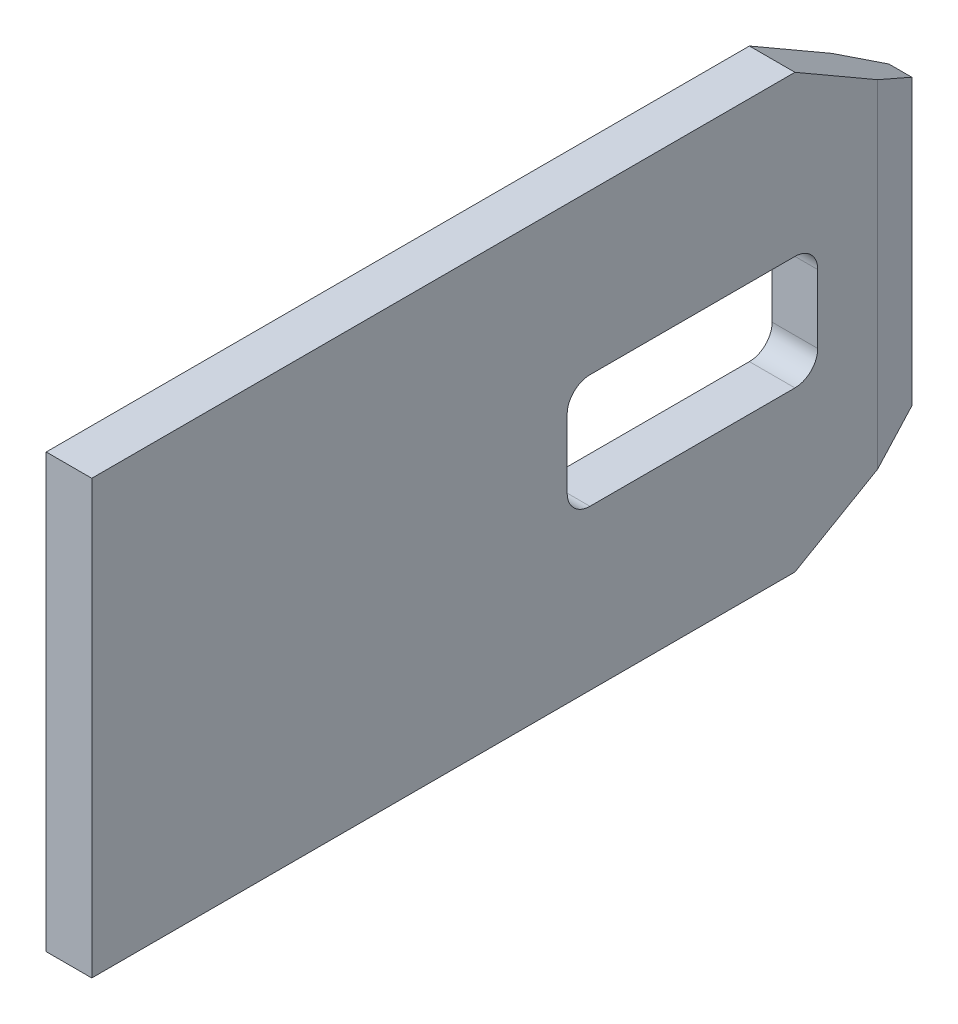
ISO-10303-21;
HEADER;
FILE_DESCRIPTION(('STEP AP214'),'2;1');
FILE_NAME('part.step','',(''),(''),'','','');
FILE_SCHEMA(('AUTOMOTIVE_DESIGN { 1 0 10303 214 1 1 1 1 }'));
ENDSEC;
DATA;
#1=APPLICATION_CONTEXT('core data for automotive mechanical design processes');
#2=APPLICATION_PROTOCOL_DEFINITION('international standard','automotive_design',2000,#1);
#3=PRODUCT_CONTEXT('',#1,'mechanical');
#4=PRODUCT('Part','Part','',(#3));
#5=PRODUCT_RELATED_PRODUCT_CATEGORY('part','',(#4));
#6=PRODUCT_DEFINITION_FORMATION('','',#4);
#7=PRODUCT_DEFINITION_CONTEXT('part definition',#1,'design');
#8=PRODUCT_DEFINITION('design','',#6,#7);
#9=PRODUCT_DEFINITION_SHAPE('','',#8);
#10=(LENGTH_UNIT() NAMED_UNIT(*) SI_UNIT(.MILLI.,.METRE.));
#11=(NAMED_UNIT(*) PLANE_ANGLE_UNIT() SI_UNIT($,.RADIAN.));
#12=(NAMED_UNIT(*) SI_UNIT($,.STERADIAN.) SOLID_ANGLE_UNIT());
#13=UNCERTAINTY_MEASURE_WITH_UNIT(LENGTH_MEASURE(1.E-05),#10,'distance_accuracy_value','');
#14=(GEOMETRIC_REPRESENTATION_CONTEXT(3) GLOBAL_UNCERTAINTY_ASSIGNED_CONTEXT((#13)) GLOBAL_UNIT_ASSIGNED_CONTEXT((#10,
#11,#12)) REPRESENTATION_CONTEXT('',''));
#15=CARTESIAN_POINT('',(0.,0.,0.));
#16=DIRECTION('',(0.,0.,1.));
#17=DIRECTION('',(1.,0.,0.));
#18=AXIS2_PLACEMENT_3D('',#15,#16,#17);
#19=CARTESIAN_POINT('',(-0.2,1.25,-7.3));
#20=DIRECTION('',(0.,0.,-1.));
#21=DIRECTION('',(0.,-1.,0.));
#22=AXIS2_PLACEMENT_3D('',#19,#20,#21);
#23=PLANE('',#22);
#24=DIRECTION('',(0.,1.,0.));
#25=VECTOR('',#24,1.);
#26=CARTESIAN_POINT('',(-0.1,-5.,-7.3));
#27=LINE('',#26,#25);
#28=CARTESIAN_POINT('',(-0.1,-1.25,-7.3));
#29=VERTEX_POINT('',#28);
#30=CARTESIAN_POINT('',(-0.1,1.25,-7.3));
#31=VERTEX_POINT('',#30);
#32=EDGE_CURVE('E39',#29,#31,#27,.T.);
#33=ORIENTED_EDGE('',*,*,#32,.T.);
#34=DIRECTION('',(1.,0.,0.));
#35=VECTOR('',#34,1.);
#36=CARTESIAN_POINT('',(-0.2,1.25,-7.3));
#37=LINE('',#36,#35);
#38=CARTESIAN_POINT('',(0.1,1.25,-7.3));
#39=VERTEX_POINT('',#38);
#40=EDGE_CURVE('E206',#31,#39,#37,.T.);
#41=ORIENTED_EDGE('',*,*,#40,.T.);
#42=DIRECTION('',(0.,1.,0.));
#43=VECTOR('',#42,1.);
#44=CARTESIAN_POINT('',(0.1,-5.,-7.3));
#45=LINE('',#44,#43);
#46=CARTESIAN_POINT('',(0.1,-1.25,-7.3));
#47=VERTEX_POINT('',#46);
#48=EDGE_CURVE('E9',#47,#39,#45,.T.);
#49=ORIENTED_EDGE('',*,*,#48,.F.);
#50=DIRECTION('',(1.,0.,0.));
#51=VECTOR('',#50,1.);
#52=CARTESIAN_POINT('',(-0.2,-1.25,-7.3));
#53=LINE('',#52,#51);
#54=EDGE_CURVE('E247',#29,#47,#53,.T.);
#55=ORIENTED_EDGE('',*,*,#54,.F.);
#56=EDGE_LOOP('',(#33,#41,#49,#55));
#57=FACE_BOUND('',#56,.T.);
#58=ADVANCED_FACE('F14',(#57),#23,.T.);
#59=CARTESIAN_POINT('',(0.1,-5.,-7.3));
#60=DIRECTION('',(0.970142500145391,0.,-0.242535625036098));
#61=DIRECTION('',(0.,-1.,0.));
#62=AXIS2_PLACEMENT_3D('',#59,#60,#61);
#63=PLANE('',#62);
#64=DIRECTION('',(0.211603684758061,-0.488677777425141,0.846414739030244));
#65=VECTOR('',#64,1.);
#66=CARTESIAN_POINT('',(0.287169866519,-1.682250291276,-6.551320533924));
#67=LINE('',#66,#65);
#68=CARTESIAN_POINT('',(0.2,-1.480940107676,-6.9));
#69=VERTEX_POINT('',#68);
#70=EDGE_CURVE('E242',#47,#69,#67,.T.);
#71=ORIENTED_EDGE('',*,*,#70,.F.);
#72=ORIENTED_EDGE('',*,*,#48,.T.);
#73=DIRECTION('',(-0.211603684758061,-0.488677777425141,-0.846414739030244));
#74=VECTOR('',#73,1.);
#75=CARTESIAN_POINT('',(-0.09543240142169,0.798668201723,-8.081729605687));
#76=LINE('',#75,#74);
#77=CARTESIAN_POINT('',(0.2,1.480940107676,-6.9));
#78=VERTEX_POINT('',#77);
#79=EDGE_CURVE('E246',#78,#39,#76,.T.);
#80=ORIENTED_EDGE('',*,*,#79,.F.);
#81=DIRECTION('',(0.,1.,0.));
#82=VECTOR('',#81,1.);
#83=CARTESIAN_POINT('',(0.2,-5.,-6.9));
#84=LINE('',#83,#82);
#85=EDGE_CURVE('E259',#69,#78,#84,.T.);
#86=ORIENTED_EDGE('',*,*,#85,.F.);
#87=EDGE_LOOP('',(#71,#72,#80,#86));
#88=FACE_BOUND('',#87,.T.);
#89=ADVANCED_FACE('F476',(#88),#63,.T.);
#90=CARTESIAN_POINT('',(-0.2,0.3,-6.17416697508));
#91=DIRECTION('',(-1.,0.,0.));
#92=DIRECTION('',(0.,1.,0.));
#93=AXIS2_PLACEMENT_3D('',#90,#91,#92);
#94=CYLINDRICAL_SURFACE('',#93,0.2);
#95=DIRECTION('',(1.,0.,0.));
#96=VECTOR('',#95,1.);
#97=CARTESIAN_POINT('',(-0.2,0.3,-6.37416697508));
#98=LINE('',#97,#96);
#99=CARTESIAN_POINT('',(-0.2,0.3,-6.37416697508));
#100=VERTEX_POINT('',#99);
#101=CARTESIAN_POINT('',(0.2,0.3,-6.37416697508));
#102=VERTEX_POINT('',#101);
#103=EDGE_CURVE('E25',#100,#102,#98,.T.);
#104=ORIENTED_EDGE('',*,*,#103,.T.);
#105=CARTESIAN_POINT('',(0.2,0.3,-6.17416697508));
#106=DIRECTION('',(1.,0.,0.));
#107=DIRECTION('',(0.,1.,0.));
#108=AXIS2_PLACEMENT_3D('',#105,#106,#107);
#109=CIRCLE('',#108,0.2);
#110=CARTESIAN_POINT('',(0.2,0.5,-6.17416697508));
#111=VERTEX_POINT('',#110);
#112=EDGE_CURVE('E263',#102,#111,#109,.T.);
#113=ORIENTED_EDGE('',*,*,#112,.T.);
#114=DIRECTION('',(1.,0.,0.));
#115=VECTOR('',#114,1.);
#116=CARTESIAN_POINT('',(-0.2,0.5,-6.17416697508));
#117=LINE('',#116,#115);
#118=CARTESIAN_POINT('',(-0.2,0.5,-6.17416697508));
#119=VERTEX_POINT('',#118);
#120=EDGE_CURVE('E142',#119,#111,#117,.T.);
#121=ORIENTED_EDGE('',*,*,#120,.F.);
#122=CARTESIAN_POINT('',(-0.2,0.3,-6.17416697508));
#123=DIRECTION('',(1.,0.,0.));
#124=DIRECTION('',(0.,1.,0.));
#125=AXIS2_PLACEMENT_3D('',#122,#123,#124);
#126=CIRCLE('',#125,0.2);
#127=EDGE_CURVE('E153',#100,#119,#126,.T.);
#128=ORIENTED_EDGE('',*,*,#127,.F.);
#129=EDGE_LOOP('',(#104,#113,#121,#128));
#130=FACE_BOUND('',#129,.T.);
#131=ADVANCED_FACE('F379',(#130),#94,.F.);
#132=CARTESIAN_POINT('',(-0.2,0.3,-6.37416697508));
#133=DIRECTION('',(0.,0.,-1.));
#134=DIRECTION('',(0.,-1.,0.));
#135=AXIS2_PLACEMENT_3D('',#132,#133,#134);
#136=PLANE('',#135);
#137=DIRECTION('',(0.,-1.,0.));
#138=VECTOR('',#137,1.);
#139=CARTESIAN_POINT('',(-0.2,0.3,-6.37416697508));
#140=LINE('',#139,#138);
#141=CARTESIAN_POINT('',(-0.2,-0.3,-6.37416697508));
#142=VERTEX_POINT('',#141);
#143=EDGE_CURVE('E146',#100,#142,#140,.T.);
#144=ORIENTED_EDGE('',*,*,#143,.T.);
#145=DIRECTION('',(1.,0.,0.));
#146=VECTOR('',#145,1.);
#147=CARTESIAN_POINT('',(-0.2,-0.3,-6.37416697508));
#148=LINE('',#147,#146);
#149=CARTESIAN_POINT('',(0.2,-0.3,-6.37416697508));
#150=VERTEX_POINT('',#149);
#151=EDGE_CURVE('E129',#142,#150,#148,.T.);
#152=ORIENTED_EDGE('',*,*,#151,.T.);
#153=DIRECTION('',(0.,-1.,0.));
#154=VECTOR('',#153,1.);
#155=CARTESIAN_POINT('',(0.2,0.3,-6.37416697508));
#156=LINE('',#155,#154);
#157=EDGE_CURVE('E267',#102,#150,#156,.T.);
#158=ORIENTED_EDGE('',*,*,#157,.F.);
#159=ORIENTED_EDGE('',*,*,#103,.F.);
#160=EDGE_LOOP('',(#144,#152,#158,#159));
#161=FACE_BOUND('',#160,.T.);
#162=ADVANCED_FACE('F147',(#161),#136,.F.);
#163=CARTESIAN_POINT('',(-0.2,0.5,-4.37416697508));
#164=DIRECTION('',(0.,1.,0.));
#165=DIRECTION('',(0.,0.,-1.));
#166=AXIS2_PLACEMENT_3D('',#163,#164,#165);
#167=PLANE('',#166);
#168=DIRECTION('',(0.,0.,-1.));
#169=VECTOR('',#168,1.);
#170=CARTESIAN_POINT('',(-0.2,0.5,-4.37416697508));
#171=LINE('',#170,#169);
#172=CARTESIAN_POINT('',(-0.2,0.5,-4.37416697508));
#173=VERTEX_POINT('',#172);
#174=EDGE_CURVE('E276',#173,#119,#171,.T.);
#175=ORIENTED_EDGE('',*,*,#174,.T.);
#176=ORIENTED_EDGE('',*,*,#120,.T.);
#177=DIRECTION('',(0.,0.,-1.));
#178=VECTOR('',#177,1.);
#179=CARTESIAN_POINT('',(0.2,0.5,-4.37416697508));
#180=LINE('',#179,#178);
#181=CARTESIAN_POINT('',(0.2,0.5,-4.37416697508));
#182=VERTEX_POINT('',#181);
#183=EDGE_CURVE('E268',#182,#111,#180,.T.);
#184=ORIENTED_EDGE('',*,*,#183,.F.);
#185=DIRECTION('',(1.,0.,0.));
#186=VECTOR('',#185,1.);
#187=CARTESIAN_POINT('',(-0.2,0.5,-4.37416697508));
#188=LINE('',#187,#186);
#189=EDGE_CURVE('E143',#173,#182,#188,.T.);
#190=ORIENTED_EDGE('',*,*,#189,.F.);
#191=EDGE_LOOP('',(#175,#176,#184,#190));
#192=FACE_BOUND('',#191,.T.);
#193=ADVANCED_FACE('F383',(#192),#167,.F.);
#194=CARTESIAN_POINT('',(-0.2,-0.3,-6.17416697508));
#195=DIRECTION('',(-1.,0.,0.));
#196=DIRECTION('',(0.,1.,0.));
#197=AXIS2_PLACEMENT_3D('',#194,#195,#196);
#198=CYLINDRICAL_SURFACE('',#197,0.2);
#199=DIRECTION('',(1.,0.,0.));
#200=VECTOR('',#199,1.);
#201=CARTESIAN_POINT('',(-0.2,-0.5,-6.17416697508));
#202=LINE('',#201,#200);
#203=CARTESIAN_POINT('',(-0.2,-0.5,-6.17416697508));
#204=VERTEX_POINT('',#203);
#205=CARTESIAN_POINT('',(0.2,-0.5,-6.17416697508));
#206=VERTEX_POINT('',#205);
#207=EDGE_CURVE('E180',#204,#206,#202,.T.);
#208=ORIENTED_EDGE('',*,*,#207,.T.);
#209=CARTESIAN_POINT('',(0.2,-0.3,-6.17416697508));
#210=DIRECTION('',(1.,0.,0.));
#211=DIRECTION('',(0.,1.,0.));
#212=AXIS2_PLACEMENT_3D('',#209,#210,#211);
#213=CIRCLE('',#212,0.2);
#214=EDGE_CURVE('E137',#206,#150,#213,.T.);
#215=ORIENTED_EDGE('',*,*,#214,.T.);
#216=ORIENTED_EDGE('',*,*,#151,.F.);
#217=CARTESIAN_POINT('',(-0.2,-0.3,-6.17416697508));
#218=DIRECTION('',(1.,0.,0.));
#219=DIRECTION('',(0.,1.,0.));
#220=AXIS2_PLACEMENT_3D('',#217,#218,#219);
#221=CIRCLE('',#220,0.2);
#222=EDGE_CURVE('E134',#204,#142,#221,.T.);
#223=ORIENTED_EDGE('',*,*,#222,.F.);
#224=EDGE_LOOP('',(#208,#215,#216,#223));
#225=FACE_BOUND('',#224,.T.);
#226=ADVANCED_FACE('F132',(#225),#198,.F.);
#227=CARTESIAN_POINT('',(-0.2,0.3,-4.37416697508));
#228=DIRECTION('',(-1.,0.,0.));
#229=DIRECTION('',(0.,1.,0.));
#230=AXIS2_PLACEMENT_3D('',#227,#228,#229);
#231=CYLINDRICAL_SURFACE('',#230,0.2);
#232=ORIENTED_EDGE('',*,*,#189,.T.);
#233=CARTESIAN_POINT('',(0.2,0.3,-4.37416697508));
#234=DIRECTION('',(1.,0.,0.));
#235=DIRECTION('',(0.,1.,0.));
#236=AXIS2_PLACEMENT_3D('',#233,#234,#235);
#237=CIRCLE('',#236,0.2);
#238=CARTESIAN_POINT('',(0.2,0.3,-4.17416697508));
#239=VERTEX_POINT('',#238);
#240=EDGE_CURVE('E191',#182,#239,#237,.T.);
#241=ORIENTED_EDGE('',*,*,#240,.T.);
#242=DIRECTION('',(1.,0.,0.));
#243=VECTOR('',#242,1.);
#244=CARTESIAN_POINT('',(-0.2,0.3,-4.17416697508));
#245=LINE('',#244,#243);
#246=CARTESIAN_POINT('',(-0.2,0.3,-4.17416697508));
#247=VERTEX_POINT('',#246);
#248=EDGE_CURVE('E176',#247,#239,#245,.T.);
#249=ORIENTED_EDGE('',*,*,#248,.F.);
#250=CARTESIAN_POINT('',(-0.2,0.3,-4.37416697508));
#251=DIRECTION('',(1.,0.,0.));
#252=DIRECTION('',(0.,1.,0.));
#253=AXIS2_PLACEMENT_3D('',#250,#251,#252);
#254=CIRCLE('',#253,0.2);
#255=EDGE_CURVE('E18',#173,#247,#254,.T.);
#256=ORIENTED_EDGE('',*,*,#255,.F.);
#257=EDGE_LOOP('',(#232,#241,#249,#256));
#258=FACE_BOUND('',#257,.T.);
#259=ADVANCED_FACE('F384',(#258),#231,.F.);
#260=CARTESIAN_POINT('',(-0.2,-0.5,-6.17416697508));
#261=DIRECTION('',(0.,-1.,0.));
#262=DIRECTION('',(-1.,0.,0.));
#263=AXIS2_PLACEMENT_3D('',#260,#261,#262);
#264=PLANE('',#263);
#265=DIRECTION('',(0.,0.,1.));
#266=VECTOR('',#265,1.);
#267=CARTESIAN_POINT('',(-0.2,-0.5,-6.17416697508));
#268=LINE('',#267,#266);
#269=CARTESIAN_POINT('',(-0.2,-0.5,-4.37416697508));
#270=VERTEX_POINT('',#269);
#271=EDGE_CURVE('E159',#204,#270,#268,.T.);
#272=ORIENTED_EDGE('',*,*,#271,.T.);
#273=DIRECTION('',(1.,0.,0.));
#274=VECTOR('',#273,1.);
#275=CARTESIAN_POINT('',(-0.2,-0.5,-4.37416697508));
#276=LINE('',#275,#274);
#277=CARTESIAN_POINT('',(0.2,-0.5,-4.37416697508));
#278=VERTEX_POINT('',#277);
#279=EDGE_CURVE('E181',#270,#278,#276,.T.);
#280=ORIENTED_EDGE('',*,*,#279,.T.);
#281=DIRECTION('',(0.,0.,1.));
#282=VECTOR('',#281,1.);
#283=CARTESIAN_POINT('',(0.2,-0.5,-6.17416697508));
#284=LINE('',#283,#282);
#285=EDGE_CURVE('E255',#206,#278,#284,.T.);
#286=ORIENTED_EDGE('',*,*,#285,.F.);
#287=ORIENTED_EDGE('',*,*,#207,.F.);
#288=EDGE_LOOP('',(#272,#280,#286,#287));
#289=FACE_BOUND('',#288,.T.);
#290=ADVANCED_FACE('F375',(#289),#264,.F.);
#291=CARTESIAN_POINT('',(-0.2,-0.3,-4.17416697508));
#292=DIRECTION('',(0.,0.,1.));
#293=DIRECTION('',(1.,0.,0.));
#294=AXIS2_PLACEMENT_3D('',#291,#292,#293);
#295=PLANE('',#294);
#296=DIRECTION('',(0.,1.,0.));
#297=VECTOR('',#296,1.);
#298=CARTESIAN_POINT('',(-0.2,-0.3,-4.17416697508));
#299=LINE('',#298,#297);
#300=CARTESIAN_POINT('',(-0.2,-0.3,-4.17416697508));
#301=VERTEX_POINT('',#300);
#302=EDGE_CURVE('E171',#301,#247,#299,.T.);
#303=ORIENTED_EDGE('',*,*,#302,.T.);
#304=ORIENTED_EDGE('',*,*,#248,.T.);
#305=DIRECTION('',(0.,1.,0.));
#306=VECTOR('',#305,1.);
#307=CARTESIAN_POINT('',(0.2,-0.3,-4.17416697508));
#308=LINE('',#307,#306);
#309=CARTESIAN_POINT('',(0.2,-0.3,-4.17416697508));
#310=VERTEX_POINT('',#309);
#311=EDGE_CURVE('E187',#310,#239,#308,.T.);
#312=ORIENTED_EDGE('',*,*,#311,.F.);
#313=DIRECTION('',(1.,0.,0.));
#314=VECTOR('',#313,1.);
#315=CARTESIAN_POINT('',(-0.2,-0.3,-4.17416697508));
#316=LINE('',#315,#314);
#317=EDGE_CURVE('E184',#301,#310,#316,.T.);
#318=ORIENTED_EDGE('',*,*,#317,.F.);
#319=EDGE_LOOP('',(#303,#304,#312,#318));
#320=FACE_BOUND('',#319,.T.);
#321=ADVANCED_FACE('F492',(#320),#295,.F.);
#322=CARTESIAN_POINT('',(-0.2,-0.3,-4.37416697508));
#323=DIRECTION('',(-1.,0.,0.));
#324=DIRECTION('',(0.,1.,0.));
#325=AXIS2_PLACEMENT_3D('',#322,#323,#324);
#326=CYLINDRICAL_SURFACE('',#325,0.2);
#327=ORIENTED_EDGE('',*,*,#317,.T.);
#328=CARTESIAN_POINT('',(0.2,-0.3,-4.37416697508));
#329=DIRECTION('',(1.,0.,0.));
#330=DIRECTION('',(0.,1.,0.));
#331=AXIS2_PLACEMENT_3D('',#328,#329,#330);
#332=CIRCLE('',#331,0.2);
#333=EDGE_CURVE('E192',#310,#278,#332,.T.);
#334=ORIENTED_EDGE('',*,*,#333,.T.);
#335=ORIENTED_EDGE('',*,*,#279,.F.);
#336=CARTESIAN_POINT('',(-0.2,-0.3,-4.37416697508));
#337=DIRECTION('',(1.,0.,0.));
#338=DIRECTION('',(0.,1.,0.));
#339=AXIS2_PLACEMENT_3D('',#336,#337,#338);
#340=CIRCLE('',#339,0.2);
#341=EDGE_CURVE('E175',#301,#270,#340,.T.);
#342=ORIENTED_EDGE('',*,*,#341,.F.);
#343=EDGE_LOOP('',(#327,#334,#335,#342));
#344=FACE_BOUND('',#343,.T.);
#345=ADVANCED_FACE('F489',(#344),#326,.F.);
#346=CARTESIAN_POINT('',(-0.2,-5.,-6.9));
#347=DIRECTION('',(-0.970142500145391,0.,-0.242535625036098));
#348=DIRECTION('',(-0.242535625036098,0.,0.970142500145391));
#349=AXIS2_PLACEMENT_3D('',#346,#347,#348);
#350=PLANE('',#349);
#351=DIRECTION('',(0.211603684758061,0.488677777425141,-0.846414739030244));
#352=VECTOR('',#351,1.);
#353=CARTESIAN_POINT('',(-0.334184791892,-1.790826610556,-6.363260832432));
#354=LINE('',#353,#352);
#355=CARTESIAN_POINT('',(-0.2,-1.480940107676,-6.9));
#356=VERTEX_POINT('',#355);
#357=EDGE_CURVE('E251',#356,#29,#354,.T.);
#358=ORIENTED_EDGE('',*,*,#357,.F.);
#359=DIRECTION('',(0.,1.,0.));
#360=VECTOR('',#359,1.);
#361=CARTESIAN_POINT('',(-0.2,-5.,-6.9));
#362=LINE('',#361,#360);
#363=CARTESIAN_POINT('',(-0.2,1.480940107676,-6.9));
#364=VERTEX_POINT('',#363);
#365=EDGE_CURVE('E169',#356,#364,#362,.T.);
#366=ORIENTED_EDGE('',*,*,#365,.T.);
#367=DIRECTION('',(-0.211603684758061,0.488677777425141,0.846414739030244));
#368=VECTOR('',#367,1.);
#369=CARTESIAN_POINT('',(0.04841747604856,0.907244521004,-7.893669904194));
#370=LINE('',#369,#368);
#371=EDGE_CURVE('E195',#31,#364,#370,.T.);
#372=ORIENTED_EDGE('',*,*,#371,.F.);
#373=ORIENTED_EDGE('',*,*,#32,.F.);
#374=EDGE_LOOP('',(#358,#366,#372,#373));
#375=FACE_BOUND('',#374,.T.);
#376=ADVANCED_FACE('F471',(#375),#350,.T.);
#377=CARTESIAN_POINT('',(-0.2,1.9,-6.17416697508));
#378=DIRECTION('',(0.,0.866025403784329,-0.50000000000019));
#379=DIRECTION('',(-1.,0.,0.));
#380=AXIS2_PLACEMENT_3D('',#377,#378,#379);
#381=PLANE('',#380);
#382=DIRECTION('',(0.,-0.50000000000019,-0.866025403784329));
#383=VECTOR('',#382,1.);
#384=CARTESIAN_POINT('',(-0.2,1.9,-6.17416697508));
#385=LINE('',#384,#383);
#386=CARTESIAN_POINT('',(-0.2,1.9,-6.17416697508));
#387=VERTEX_POINT('',#386);
#388=EDGE_CURVE('E233',#387,#364,#385,.T.);
#389=ORIENTED_EDGE('',*,*,#388,.F.);
#390=DIRECTION('',(1.,0.,0.));
#391=VECTOR('',#390,1.);
#392=CARTESIAN_POINT('',(-0.2,1.9,-6.17416697508));
#393=LINE('',#392,#391);
#394=CARTESIAN_POINT('',(0.2,1.9,-6.17416697508));
#395=VERTEX_POINT('',#394);
#396=EDGE_CURVE('E238',#387,#395,#393,.T.);
#397=ORIENTED_EDGE('',*,*,#396,.T.);
#398=DIRECTION('',(0.,-0.50000000000019,-0.866025403784329));
#399=VECTOR('',#398,1.);
#400=CARTESIAN_POINT('',(0.2,1.9,-6.17416697508));
#401=LINE('',#400,#399);
#402=EDGE_CURVE('E280',#395,#78,#401,.T.);
#403=ORIENTED_EDGE('',*,*,#402,.T.);
#404=ORIENTED_EDGE('',*,*,#79,.T.);
#405=ORIENTED_EDGE('',*,*,#40,.F.);
#406=ORIENTED_EDGE('',*,*,#371,.T.);
#407=EDGE_LOOP('',(#389,#397,#403,#404,#405,#406));
#408=FACE_BOUND('',#407,.T.);
#409=ADVANCED_FACE('F329',(#408),#381,.T.);
#410=CARTESIAN_POINT('',(-0.2,-1.25,-7.3));
#411=DIRECTION('',(0.,-0.866025403784329,-0.50000000000019));
#412=DIRECTION('',(0.,0.50000000000019,-0.866025403784329));
#413=AXIS2_PLACEMENT_3D('',#410,#411,#412);
#414=PLANE('',#413);
#415=ORIENTED_EDGE('',*,*,#357,.T.);
#416=ORIENTED_EDGE('',*,*,#54,.T.);
#417=ORIENTED_EDGE('',*,*,#70,.T.);
#418=DIRECTION('',(0.,-0.50000000000019,0.866025403784329));
#419=VECTOR('',#418,1.);
#420=CARTESIAN_POINT('',(0.2,-1.25,-7.3));
#421=LINE('',#420,#419);
#422=CARTESIAN_POINT('',(0.2,-1.9,-6.17416697508));
#423=VERTEX_POINT('',#422);
#424=EDGE_CURVE('E227',#69,#423,#421,.T.);
#425=ORIENTED_EDGE('',*,*,#424,.T.);
#426=DIRECTION('',(1.,0.,0.));
#427=VECTOR('',#426,1.);
#428=CARTESIAN_POINT('',(-0.2,-1.9,-6.17416697508));
#429=LINE('',#428,#427);
#430=CARTESIAN_POINT('',(-0.2,-1.9,-6.17416697508));
#431=VERTEX_POINT('',#430);
#432=EDGE_CURVE('E216',#431,#423,#429,.T.);
#433=ORIENTED_EDGE('',*,*,#432,.F.);
#434=DIRECTION('',(0.,-0.50000000000019,0.866025403784329));
#435=VECTOR('',#434,1.);
#436=CARTESIAN_POINT('',(-0.2,-1.25,-7.3));
#437=LINE('',#436,#435);
#438=EDGE_CURVE('E165',#356,#431,#437,.T.);
#439=ORIENTED_EDGE('',*,*,#438,.F.);
#440=EDGE_LOOP('',(#415,#416,#417,#425,#433,#439));
#441=FACE_BOUND('',#440,.T.);
#442=ADVANCED_FACE('F473',(#441),#414,.T.);
#443=CARTESIAN_POINT('',(0.2,0.,-3.875135263003));
#444=DIRECTION('',(1.,0.,0.));
#445=DIRECTION('',(0.,-1.,0.));
#446=AXIS2_PLACEMENT_3D('',#443,#444,#445);
#447=PLANE('',#446);
#448=ORIENTED_EDGE('',*,*,#333,.F.);
#449=ORIENTED_EDGE('',*,*,#311,.T.);
#450=ORIENTED_EDGE('',*,*,#240,.F.);
#451=ORIENTED_EDGE('',*,*,#183,.T.);
#452=ORIENTED_EDGE('',*,*,#112,.F.);
#453=ORIENTED_EDGE('',*,*,#157,.T.);
#454=ORIENTED_EDGE('',*,*,#214,.F.);
#455=ORIENTED_EDGE('',*,*,#285,.T.);
#456=EDGE_LOOP('',(#448,#449,#450,#451,#452,#453,#454,#455));
#457=FACE_BOUND('',#456,.T.);
#458=DIRECTION('',(0.,1.,0.));
#459=VECTOR('',#458,1.);
#460=CARTESIAN_POINT('',(0.2,-1.9,0.));
#461=LINE('',#460,#459);
#462=CARTESIAN_POINT('',(0.2,-1.9,0.));
#463=VERTEX_POINT('',#462);
#464=CARTESIAN_POINT('',(0.2,1.9,0.));
#465=VERTEX_POINT('',#464);
#466=EDGE_CURVE('E221',#463,#465,#461,.T.);
#467=ORIENTED_EDGE('',*,*,#466,.F.);
#468=DIRECTION('',(0.,0.,1.));
#469=VECTOR('',#468,1.);
#470=CARTESIAN_POINT('',(0.2,-1.9,-6.17416697508));
#471=LINE('',#470,#469);
#472=EDGE_CURVE('E211',#423,#463,#471,.T.);
#473=ORIENTED_EDGE('',*,*,#472,.F.);
#474=ORIENTED_EDGE('',*,*,#424,.F.);
#475=ORIENTED_EDGE('',*,*,#85,.T.);
#476=ORIENTED_EDGE('',*,*,#402,.F.);
#477=DIRECTION('',(0.,0.,-1.));
#478=VECTOR('',#477,1.);
#479=CARTESIAN_POINT('',(0.2,1.9,0.));
#480=LINE('',#479,#478);
#481=EDGE_CURVE('E210',#465,#395,#480,.T.);
#482=ORIENTED_EDGE('',*,*,#481,.F.);
#483=EDGE_LOOP('',(#467,#473,#474,#475,#476,#482));
#484=FACE_BOUND('',#483,.T.);
#485=ADVANCED_FACE('F324',(#457,#484),#447,.T.);
#486=CARTESIAN_POINT('',(-0.2,0.,-3.875135263003));
#487=DIRECTION('',(1.,0.,0.));
#488=DIRECTION('',(0.,-1.,0.));
#489=AXIS2_PLACEMENT_3D('',#486,#487,#488);
#490=PLANE('',#489);
#491=ORIENTED_EDGE('',*,*,#271,.F.);
#492=ORIENTED_EDGE('',*,*,#222,.T.);
#493=ORIENTED_EDGE('',*,*,#143,.F.);
#494=ORIENTED_EDGE('',*,*,#127,.T.);
#495=ORIENTED_EDGE('',*,*,#174,.F.);
#496=ORIENTED_EDGE('',*,*,#255,.T.);
#497=ORIENTED_EDGE('',*,*,#302,.F.);
#498=ORIENTED_EDGE('',*,*,#341,.T.);
#499=EDGE_LOOP('',(#491,#492,#493,#494,#495,#496,#497,#498));
#500=FACE_BOUND('',#499,.T.);
#501=DIRECTION('',(0.,0.,-1.));
#502=VECTOR('',#501,1.);
#503=CARTESIAN_POINT('',(-0.2,1.9,0.));
#504=LINE('',#503,#502);
#505=CARTESIAN_POINT('',(-0.2,1.9,0.));
#506=VERTEX_POINT('',#505);
#507=EDGE_CURVE('E237',#506,#387,#504,.T.);
#508=ORIENTED_EDGE('',*,*,#507,.T.);
#509=ORIENTED_EDGE('',*,*,#388,.T.);
#510=ORIENTED_EDGE('',*,*,#365,.F.);
#511=ORIENTED_EDGE('',*,*,#438,.T.);
#512=DIRECTION('',(0.,0.,1.));
#513=VECTOR('',#512,1.);
#514=CARTESIAN_POINT('',(-0.2,-1.9,-6.17416697508));
#515=LINE('',#514,#513);
#516=CARTESIAN_POINT('',(-0.2,-1.9,0.));
#517=VERTEX_POINT('',#516);
#518=EDGE_CURVE('E207',#431,#517,#515,.T.);
#519=ORIENTED_EDGE('',*,*,#518,.T.);
#520=DIRECTION('',(0.,1.,0.));
#521=VECTOR('',#520,1.);
#522=CARTESIAN_POINT('',(-0.2,-1.9,0.));
#523=LINE('',#522,#521);
#524=EDGE_CURVE('E212',#517,#506,#523,.T.);
#525=ORIENTED_EDGE('',*,*,#524,.T.);
#526=EDGE_LOOP('',(#508,#509,#510,#511,#519,#525));
#527=FACE_BOUND('',#526,.T.);
#528=ADVANCED_FACE('F155',(#500,#527),#490,.F.);
#529=CARTESIAN_POINT('',(-0.2,1.9,0.));
#530=DIRECTION('',(0.,1.,0.));
#531=DIRECTION('',(0.,0.,-1.));
#532=AXIS2_PLACEMENT_3D('',#529,#530,#531);
#533=PLANE('',#532);
#534=DIRECTION('',(1.,0.,0.));
#535=VECTOR('',#534,1.);
#536=CARTESIAN_POINT('',(-0.2,1.9,0.));
#537=LINE('',#536,#535);
#538=EDGE_CURVE('E217',#506,#465,#537,.T.);
#539=ORIENTED_EDGE('',*,*,#538,.T.);
#540=ORIENTED_EDGE('',*,*,#481,.T.);
#541=ORIENTED_EDGE('',*,*,#396,.F.);
#542=ORIENTED_EDGE('',*,*,#507,.F.);
#543=EDGE_LOOP('',(#539,#540,#541,#542));
#544=FACE_BOUND('',#543,.T.);
#545=ADVANCED_FACE('F320',(#544),#533,.T.);
#546=CARTESIAN_POINT('',(-0.2,-1.9,-6.17416697508));
#547=DIRECTION('',(0.,-1.,0.));
#548=DIRECTION('',(-1.,0.,0.));
#549=AXIS2_PLACEMENT_3D('',#546,#547,#548);
#550=PLANE('',#549);
#551=ORIENTED_EDGE('',*,*,#432,.T.);
#552=ORIENTED_EDGE('',*,*,#472,.T.);
#553=DIRECTION('',(1.,0.,0.));
#554=VECTOR('',#553,1.);
#555=CARTESIAN_POINT('',(-0.2,-1.9,0.));
#556=LINE('',#555,#554);
#557=EDGE_CURVE('E218',#517,#463,#556,.T.);
#558=ORIENTED_EDGE('',*,*,#557,.F.);
#559=ORIENTED_EDGE('',*,*,#518,.F.);
#560=EDGE_LOOP('',(#551,#552,#558,#559));
#561=FACE_BOUND('',#560,.T.);
#562=ADVANCED_FACE('F16',(#561),#550,.T.);
#563=CARTESIAN_POINT('',(-0.2,-1.9,0.));
#564=DIRECTION('',(0.,0.,1.));
#565=DIRECTION('',(1.,0.,0.));
#566=AXIS2_PLACEMENT_3D('',#563,#564,#565);
#567=PLANE('',#566);
#568=ORIENTED_EDGE('',*,*,#557,.T.);
#569=ORIENTED_EDGE('',*,*,#466,.T.);
#570=ORIENTED_EDGE('',*,*,#538,.F.);
#571=ORIENTED_EDGE('',*,*,#524,.F.);
#572=EDGE_LOOP('',(#568,#569,#570,#571));
#573=FACE_BOUND('',#572,.T.);
#574=ADVANCED_FACE('F337',(#573),#567,.T.);
#575=CLOSED_SHELL('',(#58,#89,#131,#162,#193,#226,#259,#290,#321,#345,#376,#409,#442,#485,#528,
#545,#562,#574));
#576=MANIFOLD_SOLID_BREP('B1',#575);
#577=ADVANCED_BREP_SHAPE_REPRESENTATION('',(#18,#576),#14);
#578=SHAPE_DEFINITION_REPRESENTATION(#9,#577);
ENDSEC;
END-ISO-10303-21;
